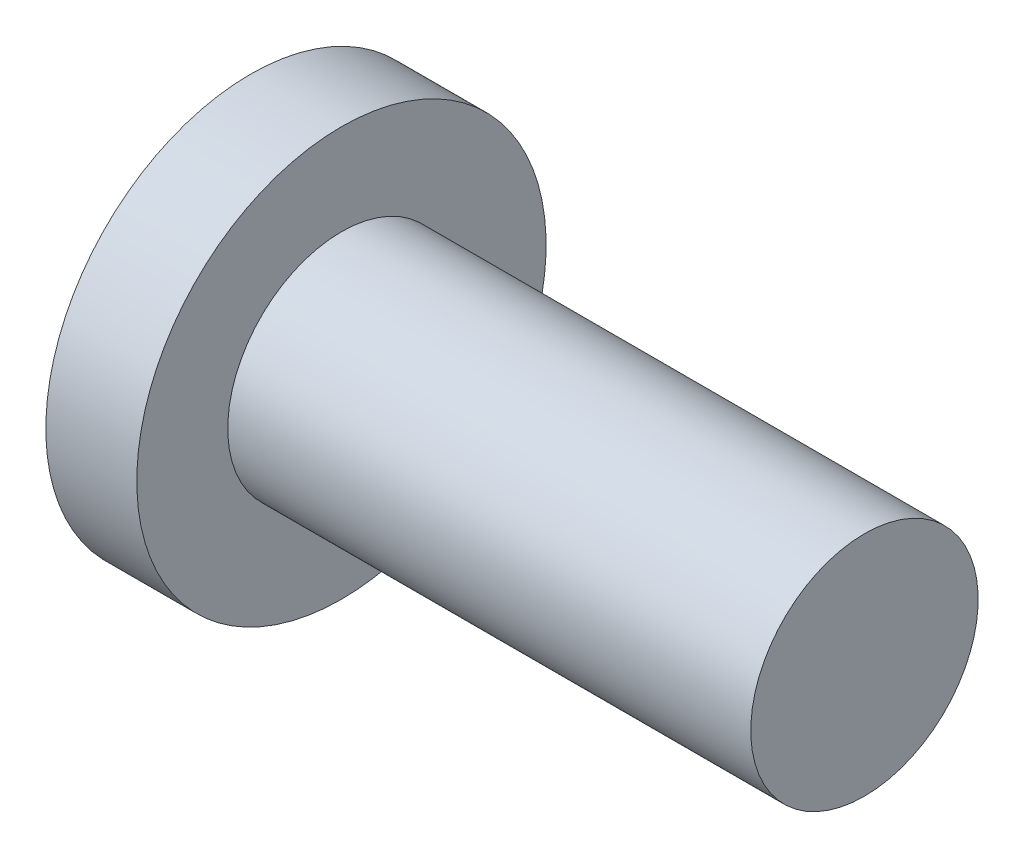
ISO-10303-21;
HEADER;
FILE_DESCRIPTION(('STEP AP214'),'2;1');
FILE_NAME('part.step','',(''),(''),'','','');
FILE_SCHEMA(('AUTOMOTIVE_DESIGN { 1 0 10303 214 1 1 1 1 }'));
ENDSEC;
DATA;
#1=APPLICATION_CONTEXT('core data for automotive mechanical design processes');
#2=APPLICATION_PROTOCOL_DEFINITION('international standard','automotive_design',2000,#1);
#3=PRODUCT_CONTEXT('',#1,'mechanical');
#4=PRODUCT('Part','Part','',(#3));
#5=PRODUCT_RELATED_PRODUCT_CATEGORY('part','',(#4));
#6=PRODUCT_DEFINITION_FORMATION('','',#4);
#7=PRODUCT_DEFINITION_CONTEXT('part definition',#1,'design');
#8=PRODUCT_DEFINITION('design','',#6,#7);
#9=PRODUCT_DEFINITION_SHAPE('','',#8);
#10=(LENGTH_UNIT() NAMED_UNIT(*) SI_UNIT(.MILLI.,.METRE.));
#11=(NAMED_UNIT(*) PLANE_ANGLE_UNIT() SI_UNIT($,.RADIAN.));
#12=(NAMED_UNIT(*) SI_UNIT($,.STERADIAN.) SOLID_ANGLE_UNIT());
#13=UNCERTAINTY_MEASURE_WITH_UNIT(LENGTH_MEASURE(1.E-05),#10,'distance_accuracy_value','');
#14=(GEOMETRIC_REPRESENTATION_CONTEXT(3) GLOBAL_UNCERTAINTY_ASSIGNED_CONTEXT((#13)) GLOBAL_UNIT_ASSIGNED_CONTEXT((#10,
#11,#12)) REPRESENTATION_CONTEXT('',''));
#15=CARTESIAN_POINT('',(0.,0.,0.));
#16=DIRECTION('',(0.,0.,1.));
#17=DIRECTION('',(1.,0.,0.));
#18=AXIS2_PLACEMENT_3D('',#15,#16,#17);
#19=CARTESIAN_POINT('',(54.,0.,0.));
#20=DIRECTION('',(-1.,0.,0.));
#21=DIRECTION('',(0.,-1.,0.));
#22=AXIS2_PLACEMENT_3D('',#19,#20,#21);
#23=PLANE('',#22);
#24=CARTESIAN_POINT('',(54.,0.,0.));
#25=DIRECTION('',(-1.,0.,0.));
#26=DIRECTION('',(0.,-1.,0.));
#27=AXIS2_PLACEMENT_3D('',#24,#25,#26);
#28=CIRCLE('',#27,10.0000000000001);
#29=CARTESIAN_POINT('',(54.,-10.0000000000001,0.));
#30=VERTEX_POINT('',#29);
#31=EDGE_CURVE('E10',#30,#30,#28,.T.);
#32=ORIENTED_EDGE('',*,*,#31,.F.);
#33=EDGE_LOOP('',(#32));
#34=FACE_BOUND('',#33,.T.);
#35=ADVANCED_FACE('F31',(#34),#23,.F.);
#36=CARTESIAN_POINT('',(-441.015873015873,-1.62188604698197E-13,0.));
#37=DIRECTION('',(-1.,0.,0.));
#38=DIRECTION('',(0.,-1.,0.));
#39=AXIS2_PLACEMENT_3D('',#36,#37,#38);
#40=CYLINDRICAL_SURFACE('',#39,10.0000000000001);
#41=CARTESIAN_POINT('',(8.00000000000001,0.,0.));
#42=DIRECTION('',(-1.,0.,0.));
#43=DIRECTION('',(0.,-1.,0.));
#44=AXIS2_PLACEMENT_3D('',#41,#42,#43);
#45=CIRCLE('',#44,10.0000000000001);
#46=CARTESIAN_POINT('',(8.00000000000001,-10.0000000000002,0.));
#47=VERTEX_POINT('',#46);
#48=EDGE_CURVE('E37',#47,#47,#45,.T.);
#49=ORIENTED_EDGE('',*,*,#48,.F.);
#50=EDGE_LOOP('',(#49));
#51=FACE_BOUND('',#50,.T.);
#52=ORIENTED_EDGE('',*,*,#31,.T.);
#53=EDGE_LOOP('',(#52));
#54=FACE_BOUND('',#53,.T.);
#55=ADVANCED_FACE('F61',(#51,#54),#40,.T.);
#56=CARTESIAN_POINT('',(8.,9.99999999999999,0.));
#57=DIRECTION('',(-1.,0.,0.));
#58=DIRECTION('',(0.,-1.,0.));
#59=AXIS2_PLACEMENT_3D('',#56,#57,#58);
#60=PLANE('',#59);
#61=CARTESIAN_POINT('',(8.00000000000001,0.,0.));
#62=DIRECTION('',(-1.,0.,0.));
#63=DIRECTION('',(0.,-1.,0.));
#64=AXIS2_PLACEMENT_3D('',#61,#62,#63);
#65=CIRCLE('',#64,18.0000000000001);
#66=CARTESIAN_POINT('',(8.00000000000001,-18.0000000000002,0.));
#67=VERTEX_POINT('',#66);
#68=EDGE_CURVE('E41',#67,#67,#65,.T.);
#69=ORIENTED_EDGE('',*,*,#68,.F.);
#70=EDGE_LOOP('',(#69));
#71=FACE_BOUND('',#70,.T.);
#72=ORIENTED_EDGE('',*,*,#48,.T.);
#73=EDGE_LOOP('',(#72));
#74=FACE_BOUND('',#73,.T.);
#75=ADVANCED_FACE('F56',(#71,#74),#60,.F.);
#76=CARTESIAN_POINT('',(-441.015873015873,-1.62188604698197E-13,0.));
#77=DIRECTION('',(-1.,0.,0.));
#78=DIRECTION('',(0.,-1.,0.));
#79=AXIS2_PLACEMENT_3D('',#76,#77,#78);
#80=CYLINDRICAL_SURFACE('',#79,18.0000000000001);
#81=CARTESIAN_POINT('',(0.,0.,0.));
#82=DIRECTION('',(-1.,0.,0.));
#83=DIRECTION('',(0.,-1.,0.));
#84=AXIS2_PLACEMENT_3D('',#81,#82,#83);
#85=CIRCLE('',#84,18.0000000000001);
#86=CARTESIAN_POINT('',(0.,-18.0000000000002,0.));
#87=VERTEX_POINT('',#86);
#88=EDGE_CURVE('E45',#87,#87,#85,.T.);
#89=ORIENTED_EDGE('',*,*,#88,.F.);
#90=EDGE_LOOP('',(#89));
#91=FACE_BOUND('',#90,.T.);
#92=ORIENTED_EDGE('',*,*,#68,.T.);
#93=EDGE_LOOP('',(#92));
#94=FACE_BOUND('',#93,.T.);
#95=ADVANCED_FACE('F53',(#91,#94),#80,.T.);
#96=CARTESIAN_POINT('',(0.,18.,0.));
#97=DIRECTION('',(1.,0.,0.));
#98=DIRECTION('',(0.,1.,0.));
#99=AXIS2_PLACEMENT_3D('',#96,#97,#98);
#100=PLANE('',#99);
#101=ORIENTED_EDGE('',*,*,#88,.T.);
#102=EDGE_LOOP('',(#101));
#103=FACE_BOUND('',#102,.T.);
#104=ADVANCED_FACE('F51',(#103),#100,.F.);
#105=CLOSED_SHELL('',(#35,#55,#75,#95,#104));
#106=MANIFOLD_SOLID_BREP('B2',#105);
#107=ADVANCED_BREP_SHAPE_REPRESENTATION('',(#18,#106),#14);
#108=SHAPE_DEFINITION_REPRESENTATION(#9,#107);
ENDSEC;
END-ISO-10303-21;
